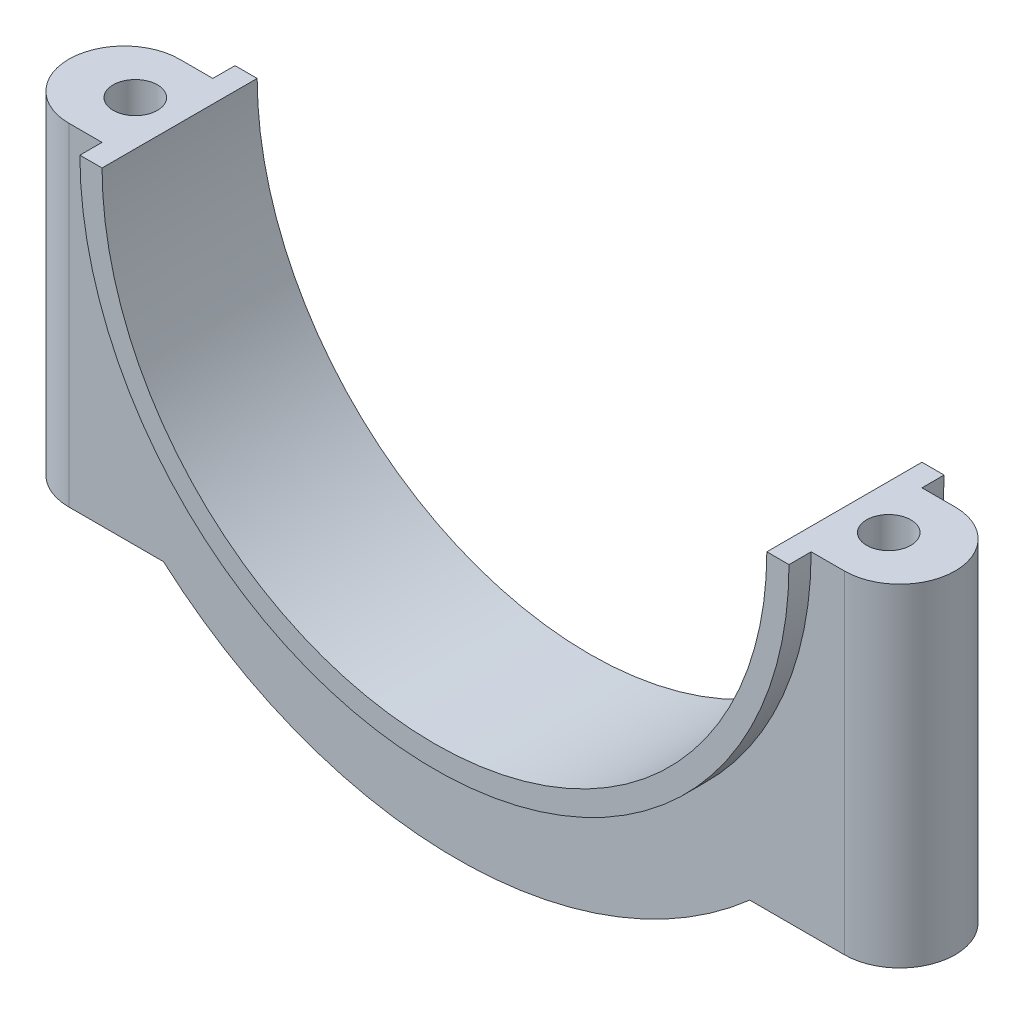
ISO-10303-21;
HEADER;
FILE_DESCRIPTION(('STEP AP214'),'2;1');
FILE_NAME('part.step','',(''),(''),'','','');
FILE_SCHEMA(('AUTOMOTIVE_DESIGN { 1 0 10303 214 1 1 1 1 }'));
ENDSEC;
DATA;
#1=APPLICATION_CONTEXT('core data for automotive mechanical design processes');
#2=APPLICATION_PROTOCOL_DEFINITION('international standard','automotive_design',2000,#1);
#3=PRODUCT_CONTEXT('',#1,'mechanical');
#4=PRODUCT('Part','Part','',(#3));
#5=PRODUCT_RELATED_PRODUCT_CATEGORY('part','',(#4));
#6=PRODUCT_DEFINITION_FORMATION('','',#4);
#7=PRODUCT_DEFINITION_CONTEXT('part definition',#1,'design');
#8=PRODUCT_DEFINITION('design','',#6,#7);
#9=PRODUCT_DEFINITION_SHAPE('','',#8);
#10=(LENGTH_UNIT() NAMED_UNIT(*) SI_UNIT(.MILLI.,.METRE.));
#11=(NAMED_UNIT(*) PLANE_ANGLE_UNIT() SI_UNIT($,.RADIAN.));
#12=(NAMED_UNIT(*) SI_UNIT($,.STERADIAN.) SOLID_ANGLE_UNIT());
#13=UNCERTAINTY_MEASURE_WITH_UNIT(LENGTH_MEASURE(1.E-05),#10,'distance_accuracy_value','');
#14=(GEOMETRIC_REPRESENTATION_CONTEXT(3) GLOBAL_UNCERTAINTY_ASSIGNED_CONTEXT((#13)) GLOBAL_UNIT_ASSIGNED_CONTEXT((#10,
#11,#12)) REPRESENTATION_CONTEXT('',''));
#15=CARTESIAN_POINT('',(0.,0.,0.));
#16=DIRECTION('',(0.,0.,1.));
#17=DIRECTION('',(1.,0.,0.));
#18=AXIS2_PLACEMENT_3D('',#15,#16,#17);
#19=CARTESIAN_POINT('',(-17.5,0.,2.5));
#20=DIRECTION('',(0.,-1.,0.));
#21=DIRECTION('',(1.,0.,0.));
#22=AXIS2_PLACEMENT_3D('',#19,#20,#21);
#23=CYLINDRICAL_SURFACE('',#22,2.5);
#24=DIRECTION('',(0.,-1.,0.));
#25=VECTOR('',#24,1.);
#26=CARTESIAN_POINT('',(-17.5,15.,0.));
#27=LINE('',#26,#25);
#28=CARTESIAN_POINT('',(-17.5,0.,0.));
#29=VERTEX_POINT('',#28);
#30=CARTESIAN_POINT('',(-17.5,15.,0.));
#31=VERTEX_POINT('',#30);
#32=EDGE_CURVE('E225',#29,#31,#27,.F.);
#33=ORIENTED_EDGE('',*,*,#32,.F.);
#34=CARTESIAN_POINT('',(-17.5,0.,2.5));
#35=DIRECTION('',(0.,1.,0.));
#36=DIRECTION('',(0.,0.,1.));
#37=AXIS2_PLACEMENT_3D('',#34,#35,#36);
#38=CIRCLE('',#37,2.5);
#39=CARTESIAN_POINT('',(-17.5,0.,5.));
#40=VERTEX_POINT('',#39);
#41=EDGE_CURVE('E64',#40,#29,#38,.F.);
#42=ORIENTED_EDGE('',*,*,#41,.F.);
#43=DIRECTION('',(0.,1.,0.));
#44=VECTOR('',#43,1.);
#45=CARTESIAN_POINT('',(-17.5,0.,5.));
#46=LINE('',#45,#44);
#47=CARTESIAN_POINT('',(-17.5,15.,5.));
#48=VERTEX_POINT('',#47);
#49=EDGE_CURVE('E228',#48,#40,#46,.F.);
#50=ORIENTED_EDGE('',*,*,#49,.F.);
#51=CARTESIAN_POINT('',(-17.5,15.,2.5));
#52=DIRECTION('',(0.,-1.,0.));
#53=DIRECTION('',(0.,0.,-1.));
#54=AXIS2_PLACEMENT_3D('',#51,#52,#53);
#55=CIRCLE('',#54,2.5);
#56=EDGE_CURVE('E49',#31,#48,#55,.F.);
#57=ORIENTED_EDGE('',*,*,#56,.F.);
#58=EDGE_LOOP('',(#33,#42,#50,#57));
#59=FACE_BOUND('',#58,.T.);
#60=ADVANCED_FACE('F41',(#59),#23,.T.);
#61=CARTESIAN_POINT('',(17.5,0.,2.5));
#62=DIRECTION('',(0.,1.,0.));
#63=DIRECTION('',(0.,0.,1.));
#64=AXIS2_PLACEMENT_3D('',#61,#62,#63);
#65=CYLINDRICAL_SURFACE('',#64,2.5);
#66=DIRECTION('',(0.,-1.,0.));
#67=VECTOR('',#66,1.);
#68=CARTESIAN_POINT('',(17.5,0.,5.));
#69=LINE('',#68,#67);
#70=CARTESIAN_POINT('',(17.5,0.,5.));
#71=VERTEX_POINT('',#70);
#72=CARTESIAN_POINT('',(17.5,15.,5.));
#73=VERTEX_POINT('',#72);
#74=EDGE_CURVE('E139',#71,#73,#69,.F.);
#75=ORIENTED_EDGE('',*,*,#74,.F.);
#76=CARTESIAN_POINT('',(17.5,0.,2.5));
#77=DIRECTION('',(0.,1.,0.));
#78=DIRECTION('',(0.,0.,1.));
#79=AXIS2_PLACEMENT_3D('',#76,#77,#78);
#80=CIRCLE('',#79,2.5);
#81=CARTESIAN_POINT('',(17.5,0.,0.));
#82=VERTEX_POINT('',#81);
#83=EDGE_CURVE('E221',#82,#71,#80,.F.);
#84=ORIENTED_EDGE('',*,*,#83,.F.);
#85=DIRECTION('',(0.,1.,0.));
#86=VECTOR('',#85,1.);
#87=CARTESIAN_POINT('',(17.5,15.,0.));
#88=LINE('',#87,#86);
#89=CARTESIAN_POINT('',(17.5,15.,0.));
#90=VERTEX_POINT('',#89);
#91=EDGE_CURVE('E218',#90,#82,#88,.F.);
#92=ORIENTED_EDGE('',*,*,#91,.F.);
#93=CARTESIAN_POINT('',(17.5,15.,2.5));
#94=DIRECTION('',(0.,-1.,0.));
#95=DIRECTION('',(0.,0.,-1.));
#96=AXIS2_PLACEMENT_3D('',#93,#94,#95);
#97=CIRCLE('',#96,2.5);
#98=EDGE_CURVE('E223',#73,#90,#97,.F.);
#99=ORIENTED_EDGE('',*,*,#98,.F.);
#100=EDGE_LOOP('',(#75,#84,#92,#99));
#101=FACE_BOUND('',#100,.T.);
#102=ADVANCED_FACE('F259',(#101),#65,.T.);
#103=CARTESIAN_POINT('',(0.,15.,5.));
#104=DIRECTION('',(0.,0.,-1.));
#105=DIRECTION('',(-1.,0.,0.));
#106=AXIS2_PLACEMENT_3D('',#103,#104,#105);
#107=CYLINDRICAL_SURFACE('',#106,15.);
#108=DIRECTION('',(0.,0.,-1.));
#109=VECTOR('',#108,1.);
#110=CARTESIAN_POINT('',(15.,15.,5.));
#111=LINE('',#110,#109);
#112=CARTESIAN_POINT('',(15.,15.,6.));
#113=VERTEX_POINT('',#112);
#114=CARTESIAN_POINT('',(15.,15.,-1.));
#115=VERTEX_POINT('',#114);
#116=EDGE_CURVE('E153',#113,#115,#111,.T.);
#117=ORIENTED_EDGE('',*,*,#116,.T.);
#118=CARTESIAN_POINT('',(0.,15.,-1.));
#119=DIRECTION('',(0.,0.,-1.));
#120=DIRECTION('',(1.,0.,0.));
#121=AXIS2_PLACEMENT_3D('',#118,#119,#120);
#122=CIRCLE('',#121,15.);
#123=CARTESIAN_POINT('',(-15.,15.,-1.));
#124=VERTEX_POINT('',#123);
#125=EDGE_CURVE('E147',#115,#124,#122,.T.);
#126=ORIENTED_EDGE('',*,*,#125,.T.);
#127=DIRECTION('',(0.,0.,-1.));
#128=VECTOR('',#127,1.);
#129=CARTESIAN_POINT('',(-15.,15.,5.));
#130=LINE('',#129,#128);
#131=CARTESIAN_POINT('',(-15.,15.,6.));
#132=VERTEX_POINT('',#131);
#133=EDGE_CURVE('E129',#132,#124,#130,.T.);
#134=ORIENTED_EDGE('',*,*,#133,.F.);
#135=CARTESIAN_POINT('',(0.,15.,6.));
#136=DIRECTION('',(0.,0.,-1.));
#137=DIRECTION('',(1.,0.,0.));
#138=AXIS2_PLACEMENT_3D('',#135,#136,#137);
#139=CIRCLE('',#138,15.);
#140=EDGE_CURVE('E170',#113,#132,#139,.T.);
#141=ORIENTED_EDGE('',*,*,#140,.F.);
#142=EDGE_LOOP('',(#117,#126,#134,#141));
#143=FACE_BOUND('',#142,.T.);
#144=ADVANCED_FACE('F152',(#143),#107,.F.);
#145=CARTESIAN_POINT('',(-20.,15.,5.));
#146=DIRECTION('',(0.,-1.,0.));
#147=DIRECTION('',(0.,0.,-1.));
#148=AXIS2_PLACEMENT_3D('',#145,#146,#147);
#149=PLANE('',#148);
#150=CARTESIAN_POINT('',(-17.,15.,2.5));
#151=DIRECTION('',(0.,1.,0.));
#152=DIRECTION('',(0.,0.,1.));
#153=AXIS2_PLACEMENT_3D('',#150,#151,#152);
#154=CIRCLE('',#153,1.);
#155=CARTESIAN_POINT('',(-17.,15.,3.5));
#156=VERTEX_POINT('',#155);
#157=EDGE_CURVE('E157',#156,#156,#154,.T.);
#158=ORIENTED_EDGE('',*,*,#157,.F.);
#159=EDGE_LOOP('',(#158));
#160=FACE_BOUND('',#159,.T.);
#161=ORIENTED_EDGE('',*,*,#133,.T.);
#162=DIRECTION('',(-1.,0.,0.));
#163=VECTOR('',#162,1.);
#164=CARTESIAN_POINT('',(-16.,15.,-1.));
#165=LINE('',#164,#163);
#166=CARTESIAN_POINT('',(-16.,15.,-1.));
#167=VERTEX_POINT('',#166);
#168=EDGE_CURVE('E132',#124,#167,#165,.T.);
#169=ORIENTED_EDGE('',*,*,#168,.T.);
#170=DIRECTION('',(0.,0.,1.));
#171=VECTOR('',#170,1.);
#172=CARTESIAN_POINT('',(-16.,15.,-1.));
#173=LINE('',#172,#171);
#174=CARTESIAN_POINT('',(-16.,15.,0.));
#175=VERTEX_POINT('',#174);
#176=EDGE_CURVE('E56',#167,#175,#173,.T.);
#177=ORIENTED_EDGE('',*,*,#176,.T.);
#178=DIRECTION('',(-1.,0.,0.));
#179=VECTOR('',#178,1.);
#180=CARTESIAN_POINT('',(-20.,15.,0.));
#181=LINE('',#180,#179);
#182=EDGE_CURVE('E186',#175,#31,#181,.T.);
#183=ORIENTED_EDGE('',*,*,#182,.T.);
#184=ORIENTED_EDGE('',*,*,#56,.T.);
#185=DIRECTION('',(-1.,0.,0.));
#186=VECTOR('',#185,1.);
#187=CARTESIAN_POINT('',(-20.,15.,5.));
#188=LINE('',#187,#186);
#189=CARTESIAN_POINT('',(-16.,15.,5.));
#190=VERTEX_POINT('',#189);
#191=EDGE_CURVE('E187',#190,#48,#188,.T.);
#192=ORIENTED_EDGE('',*,*,#191,.F.);
#193=DIRECTION('',(0.,0.,-1.));
#194=VECTOR('',#193,1.);
#195=CARTESIAN_POINT('',(-16.,15.,6.));
#196=LINE('',#195,#194);
#197=CARTESIAN_POINT('',(-16.,15.,6.));
#198=VERTEX_POINT('',#197);
#199=EDGE_CURVE('E183',#198,#190,#196,.T.);
#200=ORIENTED_EDGE('',*,*,#199,.F.);
#201=DIRECTION('',(-1.,0.,0.));
#202=VECTOR('',#201,1.);
#203=CARTESIAN_POINT('',(-16.,15.,6.));
#204=LINE('',#203,#202);
#205=EDGE_CURVE('E134',#132,#198,#204,.T.);
#206=ORIENTED_EDGE('',*,*,#205,.F.);
#207=EDGE_LOOP('',(#161,#169,#177,#183,#184,#192,#200,#206));
#208=FACE_BOUND('',#207,.T.);
#209=ADVANCED_FACE('F131',(#160,#208),#149,.F.);
#210=CARTESIAN_POINT('',(-20.,0.,5.));
#211=DIRECTION('',(0.,1.,0.));
#212=DIRECTION('',(0.,0.,1.));
#213=AXIS2_PLACEMENT_3D('',#210,#211,#212);
#214=PLANE('',#213);
#215=CARTESIAN_POINT('',(-17.,0.,2.5));
#216=DIRECTION('',(0.,1.,0.));
#217=DIRECTION('',(0.,0.,1.));
#218=AXIS2_PLACEMENT_3D('',#215,#216,#217);
#219=CIRCLE('',#218,1.);
#220=CARTESIAN_POINT('',(-17.,0.,3.5));
#221=VERTEX_POINT('',#220);
#222=EDGE_CURVE('E154',#221,#221,#219,.T.);
#223=ORIENTED_EDGE('',*,*,#222,.T.);
#224=EDGE_LOOP('',(#223));
#225=FACE_BOUND('',#224,.T.);
#226=DIRECTION('',(1.,0.,0.));
#227=VECTOR('',#226,1.);
#228=CARTESIAN_POINT('',(-20.,0.,5.));
#229=LINE('',#228,#227);
#230=CARTESIAN_POINT('',(-13.228756555323,0.,5.));
#231=VERTEX_POINT('',#230);
#232=EDGE_CURVE('E190',#40,#231,#229,.T.);
#233=ORIENTED_EDGE('',*,*,#232,.F.);
#234=ORIENTED_EDGE('',*,*,#41,.T.);
#235=DIRECTION('',(1.,0.,0.));
#236=VECTOR('',#235,1.);
#237=CARTESIAN_POINT('',(-20.,0.,0.));
#238=LINE('',#237,#236);
#239=CARTESIAN_POINT('',(-13.228756555323,0.,0.));
#240=VERTEX_POINT('',#239);
#241=EDGE_CURVE('E201',#29,#240,#238,.T.);
#242=ORIENTED_EDGE('',*,*,#241,.T.);
#243=DIRECTION('',(0.,0.,-1.));
#244=VECTOR('',#243,1.);
#245=CARTESIAN_POINT('',(-13.228756555323,0.,5.));
#246=LINE('',#245,#244);
#247=EDGE_CURVE('E140',#231,#240,#246,.T.);
#248=ORIENTED_EDGE('',*,*,#247,.F.);
#249=EDGE_LOOP('',(#233,#234,#242,#248));
#250=FACE_BOUND('',#249,.T.);
#251=ADVANCED_FACE('F275',(#225,#250),#214,.F.);
#252=CARTESIAN_POINT('',(0.,15.,5.));
#253=DIRECTION('',(0.,0.,-1.));
#254=DIRECTION('',(-1.,0.,0.));
#255=AXIS2_PLACEMENT_3D('',#252,#253,#254);
#256=CYLINDRICAL_SURFACE('',#255,20.);
#257=CARTESIAN_POINT('',(0.,15.,0.));
#258=DIRECTION('',(0.,0.,1.));
#259=DIRECTION('',(1.,0.,0.));
#260=AXIS2_PLACEMENT_3D('',#257,#258,#259);
#261=CIRCLE('',#260,20.);
#262=CARTESIAN_POINT('',(13.228756555323,0.,0.));
#263=VERTEX_POINT('',#262);
#264=EDGE_CURVE('E203',#240,#263,#261,.T.);
#265=ORIENTED_EDGE('',*,*,#264,.T.);
#266=DIRECTION('',(0.,0.,-1.));
#267=VECTOR('',#266,1.);
#268=CARTESIAN_POINT('',(13.228756555323,0.,5.));
#269=LINE('',#268,#267);
#270=CARTESIAN_POINT('',(13.228756555323,0.,5.));
#271=VERTEX_POINT('',#270);
#272=EDGE_CURVE('E211',#271,#263,#269,.T.);
#273=ORIENTED_EDGE('',*,*,#272,.F.);
#274=CARTESIAN_POINT('',(0.,15.,5.));
#275=DIRECTION('',(0.,0.,1.));
#276=DIRECTION('',(1.,0.,0.));
#277=AXIS2_PLACEMENT_3D('',#274,#275,#276);
#278=CIRCLE('',#277,20.);
#279=EDGE_CURVE('E193',#231,#271,#278,.T.);
#280=ORIENTED_EDGE('',*,*,#279,.F.);
#281=ORIENTED_EDGE('',*,*,#247,.T.);
#282=EDGE_LOOP('',(#265,#273,#280,#281));
#283=FACE_BOUND('',#282,.T.);
#284=ADVANCED_FACE('F279',(#283),#256,.T.);
#285=CARTESIAN_POINT('',(20.,0.,5.));
#286=DIRECTION('',(0.,1.,0.));
#287=DIRECTION('',(0.,0.,1.));
#288=AXIS2_PLACEMENT_3D('',#285,#286,#287);
#289=PLANE('',#288);
#290=CARTESIAN_POINT('',(17.,0.,2.5));
#291=DIRECTION('',(0.,1.,0.));
#292=DIRECTION('',(0.,0.,1.));
#293=AXIS2_PLACEMENT_3D('',#290,#291,#292);
#294=CIRCLE('',#293,1.);
#295=CARTESIAN_POINT('',(17.,0.,3.5));
#296=VERTEX_POINT('',#295);
#297=EDGE_CURVE('E160',#296,#296,#294,.T.);
#298=ORIENTED_EDGE('',*,*,#297,.T.);
#299=EDGE_LOOP('',(#298));
#300=FACE_BOUND('',#299,.T.);
#301=DIRECTION('',(1.,0.,0.));
#302=VECTOR('',#301,1.);
#303=CARTESIAN_POINT('',(20.,0.,0.));
#304=LINE('',#303,#302);
#305=EDGE_CURVE('E205',#263,#82,#304,.T.);
#306=ORIENTED_EDGE('',*,*,#305,.T.);
#307=ORIENTED_EDGE('',*,*,#83,.T.);
#308=DIRECTION('',(1.,0.,0.));
#309=VECTOR('',#308,1.);
#310=CARTESIAN_POINT('',(20.,0.,5.));
#311=LINE('',#310,#309);
#312=EDGE_CURVE('E195',#271,#71,#311,.T.);
#313=ORIENTED_EDGE('',*,*,#312,.F.);
#314=ORIENTED_EDGE('',*,*,#272,.T.);
#315=EDGE_LOOP('',(#306,#307,#313,#314));
#316=FACE_BOUND('',#315,.T.);
#317=ADVANCED_FACE('F283',(#300,#316),#289,.F.);
#318=CARTESIAN_POINT('',(15.,15.,5.));
#319=DIRECTION('',(0.,-1.,0.));
#320=DIRECTION('',(0.,0.,-1.));
#321=AXIS2_PLACEMENT_3D('',#318,#319,#320);
#322=PLANE('',#321);
#323=CARTESIAN_POINT('',(17.,15.,2.5));
#324=DIRECTION('',(0.,1.,0.));
#325=DIRECTION('',(0.,0.,1.));
#326=AXIS2_PLACEMENT_3D('',#323,#324,#325);
#327=CIRCLE('',#326,1.);
#328=CARTESIAN_POINT('',(17.,15.,3.5));
#329=VERTEX_POINT('',#328);
#330=EDGE_CURVE('E412',#329,#329,#327,.T.);
#331=ORIENTED_EDGE('',*,*,#330,.F.);
#332=EDGE_LOOP('',(#331));
#333=FACE_BOUND('',#332,.T.);
#334=DIRECTION('',(0.,0.,-1.));
#335=VECTOR('',#334,1.);
#336=CARTESIAN_POINT('',(16.,15.,6.));
#337=LINE('',#336,#335);
#338=CARTESIAN_POINT('',(16.,15.,6.));
#339=VERTEX_POINT('',#338);
#340=CARTESIAN_POINT('',(16.,15.,5.));
#341=VERTEX_POINT('',#340);
#342=EDGE_CURVE('E178',#339,#341,#337,.T.);
#343=ORIENTED_EDGE('',*,*,#342,.T.);
#344=DIRECTION('',(-1.,0.,0.));
#345=VECTOR('',#344,1.);
#346=CARTESIAN_POINT('',(15.,15.,5.));
#347=LINE('',#346,#345);
#348=EDGE_CURVE('E198',#73,#341,#347,.T.);
#349=ORIENTED_EDGE('',*,*,#348,.F.);
#350=ORIENTED_EDGE('',*,*,#98,.T.);
#351=DIRECTION('',(-1.,0.,0.));
#352=VECTOR('',#351,1.);
#353=CARTESIAN_POINT('',(15.,15.,0.));
#354=LINE('',#353,#352);
#355=CARTESIAN_POINT('',(16.,15.,0.));
#356=VERTEX_POINT('',#355);
#357=EDGE_CURVE('E191',#90,#356,#354,.T.);
#358=ORIENTED_EDGE('',*,*,#357,.T.);
#359=DIRECTION('',(0.,0.,1.));
#360=VECTOR('',#359,1.);
#361=CARTESIAN_POINT('',(16.,15.,-1.));
#362=LINE('',#361,#360);
#363=CARTESIAN_POINT('',(16.,15.,-1.));
#364=VERTEX_POINT('',#363);
#365=EDGE_CURVE('E166',#364,#356,#362,.T.);
#366=ORIENTED_EDGE('',*,*,#365,.F.);
#367=DIRECTION('',(-1.,0.,0.));
#368=VECTOR('',#367,1.);
#369=CARTESIAN_POINT('',(15.,15.,-1.));
#370=LINE('',#369,#368);
#371=EDGE_CURVE('E164',#364,#115,#370,.T.);
#372=ORIENTED_EDGE('',*,*,#371,.T.);
#373=ORIENTED_EDGE('',*,*,#116,.F.);
#374=DIRECTION('',(-1.,0.,0.));
#375=VECTOR('',#374,1.);
#376=CARTESIAN_POINT('',(15.,15.,6.));
#377=LINE('',#376,#375);
#378=EDGE_CURVE('E175',#339,#113,#377,.T.);
#379=ORIENTED_EDGE('',*,*,#378,.F.);
#380=EDGE_LOOP('',(#343,#349,#350,#358,#366,#372,#373,#379));
#381=FACE_BOUND('',#380,.T.);
#382=ADVANCED_FACE('F243',(#333,#381),#322,.F.);
#383=CARTESIAN_POINT('',(0.,15.,5.));
#384=DIRECTION('',(0.,0.,1.));
#385=DIRECTION('',(1.,0.,0.));
#386=AXIS2_PLACEMENT_3D('',#383,#384,#385);
#387=PLANE('',#386);
#388=ORIENTED_EDGE('',*,*,#191,.T.);
#389=ORIENTED_EDGE('',*,*,#49,.T.);
#390=ORIENTED_EDGE('',*,*,#232,.T.);
#391=ORIENTED_EDGE('',*,*,#279,.T.);
#392=ORIENTED_EDGE('',*,*,#312,.T.);
#393=ORIENTED_EDGE('',*,*,#74,.T.);
#394=ORIENTED_EDGE('',*,*,#348,.T.);
#395=CARTESIAN_POINT('',(0.,15.,5.));
#396=DIRECTION('',(0.,0.,1.));
#397=DIRECTION('',(1.,0.,0.));
#398=AXIS2_PLACEMENT_3D('',#395,#396,#397);
#399=CIRCLE('',#398,16.);
#400=EDGE_CURVE('E168',#190,#341,#399,.T.);
#401=ORIENTED_EDGE('',*,*,#400,.F.);
#402=EDGE_LOOP('',(#388,#389,#390,#391,#392,#393,#394,#401));
#403=FACE_BOUND('',#402,.T.);
#404=ADVANCED_FACE('F235',(#403),#387,.T.);
#405=CARTESIAN_POINT('',(0.,15.,0.));
#406=DIRECTION('',(0.,0.,1.));
#407=DIRECTION('',(1.,0.,0.));
#408=AXIS2_PLACEMENT_3D('',#405,#406,#407);
#409=PLANE('',#408);
#410=ORIENTED_EDGE('',*,*,#182,.F.);
#411=CARTESIAN_POINT('',(0.,15.,0.));
#412=DIRECTION('',(0.,0.,1.));
#413=DIRECTION('',(1.,0.,0.));
#414=AXIS2_PLACEMENT_3D('',#411,#412,#413);
#415=CIRCLE('',#414,16.);
#416=EDGE_CURVE('E11',#175,#356,#415,.T.);
#417=ORIENTED_EDGE('',*,*,#416,.T.);
#418=ORIENTED_EDGE('',*,*,#357,.F.);
#419=ORIENTED_EDGE('',*,*,#91,.T.);
#420=ORIENTED_EDGE('',*,*,#305,.F.);
#421=ORIENTED_EDGE('',*,*,#264,.F.);
#422=ORIENTED_EDGE('',*,*,#241,.F.);
#423=ORIENTED_EDGE('',*,*,#32,.T.);
#424=EDGE_LOOP('',(#410,#417,#418,#419,#420,#421,#422,#423));
#425=FACE_BOUND('',#424,.T.);
#426=ADVANCED_FACE('F256',(#425),#409,.F.);
#427=CARTESIAN_POINT('',(0.,15.,6.));
#428=DIRECTION('',(0.,0.,-1.));
#429=DIRECTION('',(-1.,0.,0.));
#430=AXIS2_PLACEMENT_3D('',#427,#428,#429);
#431=CYLINDRICAL_SURFACE('',#430,16.);
#432=ORIENTED_EDGE('',*,*,#400,.T.);
#433=ORIENTED_EDGE('',*,*,#342,.F.);
#434=CARTESIAN_POINT('',(0.,15.,6.));
#435=DIRECTION('',(0.,0.,1.));
#436=DIRECTION('',(1.,0.,0.));
#437=AXIS2_PLACEMENT_3D('',#434,#435,#436);
#438=CIRCLE('',#437,16.);
#439=EDGE_CURVE('E173',#198,#339,#438,.T.);
#440=ORIENTED_EDGE('',*,*,#439,.F.);
#441=ORIENTED_EDGE('',*,*,#199,.T.);
#442=EDGE_LOOP('',(#432,#433,#440,#441));
#443=FACE_BOUND('',#442,.T.);
#444=ADVANCED_FACE('F239',(#443),#431,.T.);
#445=CARTESIAN_POINT('',(0.,15.,6.));
#446=DIRECTION('',(0.,0.,1.));
#447=DIRECTION('',(1.,0.,0.));
#448=AXIS2_PLACEMENT_3D('',#445,#446,#447);
#449=PLANE('',#448);
#450=ORIENTED_EDGE('',*,*,#140,.T.);
#451=ORIENTED_EDGE('',*,*,#205,.T.);
#452=ORIENTED_EDGE('',*,*,#439,.T.);
#453=ORIENTED_EDGE('',*,*,#378,.T.);
#454=EDGE_LOOP('',(#450,#451,#452,#453));
#455=FACE_BOUND('',#454,.T.);
#456=ADVANCED_FACE('F245',(#455),#449,.T.);
#457=CARTESIAN_POINT('',(0.,15.,-1.));
#458=DIRECTION('',(0.,0.,1.));
#459=DIRECTION('',(1.,0.,0.));
#460=AXIS2_PLACEMENT_3D('',#457,#458,#459);
#461=CYLINDRICAL_SURFACE('',#460,16.);
#462=ORIENTED_EDGE('',*,*,#416,.F.);
#463=ORIENTED_EDGE('',*,*,#176,.F.);
#464=CARTESIAN_POINT('',(0.,15.,-1.));
#465=DIRECTION('',(0.,0.,1.));
#466=DIRECTION('',(1.,0.,0.));
#467=AXIS2_PLACEMENT_3D('',#464,#465,#466);
#468=CIRCLE('',#467,16.);
#469=EDGE_CURVE('E150',#167,#364,#468,.T.);
#470=ORIENTED_EDGE('',*,*,#469,.T.);
#471=ORIENTED_EDGE('',*,*,#365,.T.);
#472=EDGE_LOOP('',(#462,#463,#470,#471));
#473=FACE_BOUND('',#472,.T.);
#474=ADVANCED_FACE('F247',(#473),#461,.T.);
#475=CARTESIAN_POINT('',(0.,15.,-1.));
#476=DIRECTION('',(0.,0.,1.));
#477=DIRECTION('',(1.,0.,0.));
#478=AXIS2_PLACEMENT_3D('',#475,#476,#477);
#479=PLANE('',#478);
#480=ORIENTED_EDGE('',*,*,#125,.F.);
#481=ORIENTED_EDGE('',*,*,#371,.F.);
#482=ORIENTED_EDGE('',*,*,#469,.F.);
#483=ORIENTED_EDGE('',*,*,#168,.F.);
#484=EDGE_LOOP('',(#480,#481,#482,#483));
#485=FACE_BOUND('',#484,.T.);
#486=ADVANCED_FACE('F145',(#485),#479,.F.);
#487=CARTESIAN_POINT('',(17.,0.,2.5));
#488=DIRECTION('',(0.,1.,0.));
#489=DIRECTION('',(0.,0.,1.));
#490=AXIS2_PLACEMENT_3D('',#487,#488,#489);
#491=CYLINDRICAL_SURFACE('',#490,1.);
#492=ORIENTED_EDGE('',*,*,#297,.F.);
#493=EDGE_LOOP('',(#492));
#494=FACE_BOUND('',#493,.T.);
#495=ORIENTED_EDGE('',*,*,#330,.T.);
#496=EDGE_LOOP('',(#495));
#497=FACE_BOUND('',#496,.T.);
#498=ADVANCED_FACE('F320',(#494,#497),#491,.F.);
#499=CARTESIAN_POINT('',(-17.,0.,2.5));
#500=DIRECTION('',(0.,1.,0.));
#501=DIRECTION('',(0.,0.,1.));
#502=AXIS2_PLACEMENT_3D('',#499,#500,#501);
#503=CYLINDRICAL_SURFACE('',#502,1.);
#504=ORIENTED_EDGE('',*,*,#222,.F.);
#505=EDGE_LOOP('',(#504));
#506=FACE_BOUND('',#505,.T.);
#507=ORIENTED_EDGE('',*,*,#157,.T.);
#508=EDGE_LOOP('',(#507));
#509=FACE_BOUND('',#508,.T.);
#510=ADVANCED_FACE('F349',(#506,#509),#503,.F.);
#511=CLOSED_SHELL('',(#60,#102,#144,#209,#251,#284,#317,#382,#404,#426,#444,#456,#474,#486,#498,#510));
#512=MANIFOLD_SOLID_BREP('B2',#511);
#513=ADVANCED_BREP_SHAPE_REPRESENTATION('',(#18,#512),#14);
#514=SHAPE_DEFINITION_REPRESENTATION(#9,#513);
ENDSEC;
END-ISO-10303-21;
